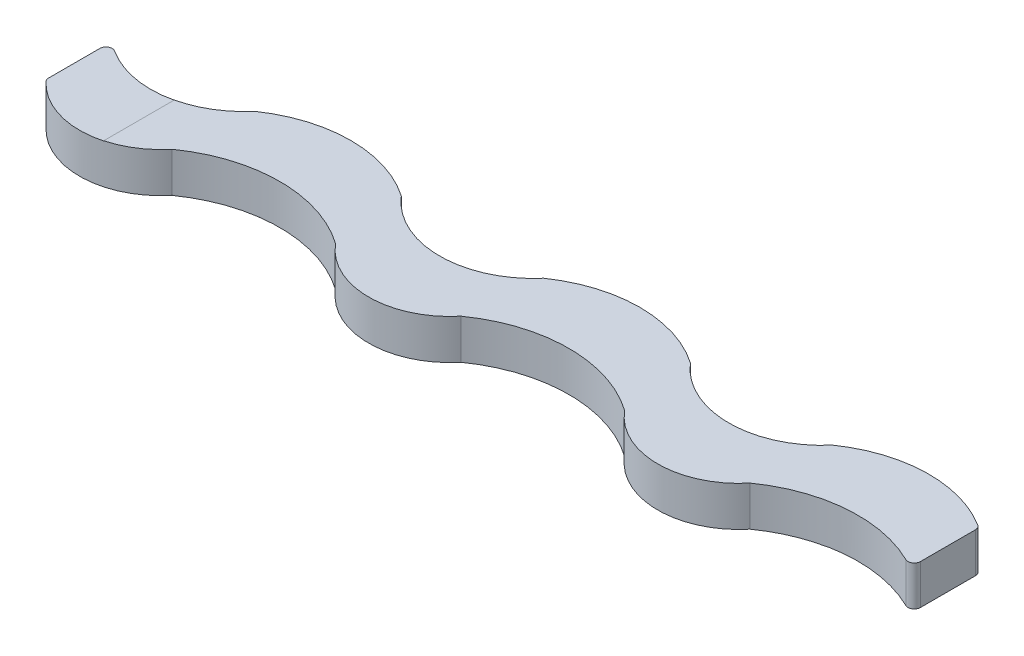
ISO-10303-21;
HEADER;
FILE_DESCRIPTION(('STEP AP214'),'2;1');
FILE_NAME('part.step','',(''),(''),'','','');
FILE_SCHEMA(('AUTOMOTIVE_DESIGN { 1 0 10303 214 1 1 1 1 }'));
ENDSEC;
DATA;
#1=APPLICATION_CONTEXT('core data for automotive mechanical design processes');
#2=APPLICATION_PROTOCOL_DEFINITION('international standard','automotive_design',2000,#1);
#3=PRODUCT_CONTEXT('',#1,'mechanical');
#4=PRODUCT('Part','Part','',(#3));
#5=PRODUCT_RELATED_PRODUCT_CATEGORY('part','',(#4));
#6=PRODUCT_DEFINITION_FORMATION('','',#4);
#7=PRODUCT_DEFINITION_CONTEXT('part definition',#1,'design');
#8=PRODUCT_DEFINITION('design','',#6,#7);
#9=PRODUCT_DEFINITION_SHAPE('','',#8);
#10=(LENGTH_UNIT() NAMED_UNIT(*) SI_UNIT(.MILLI.,.METRE.));
#11=(NAMED_UNIT(*) PLANE_ANGLE_UNIT() SI_UNIT($,.RADIAN.));
#12=(NAMED_UNIT(*) SI_UNIT($,.STERADIAN.) SOLID_ANGLE_UNIT());
#13=UNCERTAINTY_MEASURE_WITH_UNIT(LENGTH_MEASURE(1.E-05),#10,'distance_accuracy_value','');
#14=(GEOMETRIC_REPRESENTATION_CONTEXT(3) GLOBAL_UNCERTAINTY_ASSIGNED_CONTEXT((#13)) GLOBAL_UNIT_ASSIGNED_CONTEXT((#10,
#11,#12)) REPRESENTATION_CONTEXT('',''));
#15=CARTESIAN_POINT('',(0.,0.,0.));
#16=DIRECTION('',(0.,0.,1.));
#17=DIRECTION('',(1.,0.,0.));
#18=AXIS2_PLACEMENT_3D('',#15,#16,#17);
#19=CARTESIAN_POINT('',(-4.86603507649998,-77.2927912107603,5.70716239774827));
#20=DIRECTION('',(-1.,0.,0.));
#21=DIRECTION('',(0.,0.,1.));
#22=AXIS2_PLACEMENT_3D('',#19,#20,#21);
#23=PLANE('',#22);
#24=DIRECTION('',(0.,1.,0.));
#25=VECTOR('',#24,1.);
#26=CARTESIAN_POINT('',(-4.86603507649998,-77.2927912107603,10.8016440320148));
#27=LINE('',#26,#25);
#28=CARTESIAN_POINT('',(-4.86603507649998,0.,10.8016440320148));
#29=VERTEX_POINT('',#28);
#30=CARTESIAN_POINT('',(-4.86603507649998,3.19,10.8016440320148));
#31=VERTEX_POINT('',#30);
#32=EDGE_CURVE('E263',#29,#31,#27,.T.);
#33=ORIENTED_EDGE('',*,*,#32,.T.);
#34=DIRECTION('',(0.,0.,-1.));
#35=VECTOR('',#34,1.);
#36=CARTESIAN_POINT('',(-4.86603507649998,3.19,5.70716239774827));
#37=LINE('',#36,#35);
#38=CARTESIAN_POINT('',(-4.86603507649998,3.19,6.70356156910438));
#39=VERTEX_POINT('',#38);
#40=EDGE_CURVE('E410',#31,#39,#37,.T.);
#41=ORIENTED_EDGE('',*,*,#40,.T.);
#42=DIRECTION('',(0.,1.,0.));
#43=VECTOR('',#42,1.);
#44=CARTESIAN_POINT('',(-4.86603507649998,-77.2927912107603,6.70356156910438));
#45=LINE('',#44,#43);
#46=CARTESIAN_POINT('',(-4.86603507649998,0.,6.70356156910438));
#47=VERTEX_POINT('',#46);
#48=EDGE_CURVE('E261',#39,#47,#45,.F.);
#49=ORIENTED_EDGE('',*,*,#48,.T.);
#50=DIRECTION('',(0.,0.,-1.));
#51=VECTOR('',#50,1.);
#52=CARTESIAN_POINT('',(-4.86603507649998,0.,5.70716239774827));
#53=LINE('',#52,#51);
#54=EDGE_CURVE('E374',#29,#47,#53,.T.);
#55=ORIENTED_EDGE('',*,*,#54,.F.);
#56=EDGE_LOOP('',(#33,#41,#49,#55));
#57=FACE_BOUND('',#56,.T.);
#58=ADVANCED_FACE('F49',(#57),#23,.T.);
#59=CARTESIAN_POINT('',(-4.36603507649998,-77.2927912107603,10.8016440320148));
#60=DIRECTION('',(0.,1.,0.));
#61=DIRECTION('',(0.,0.,1.));
#62=AXIS2_PLACEMENT_3D('',#59,#60,#61);
#63=CYLINDRICAL_SURFACE('',#62,0.5);
#64=DIRECTION('',(0.,1.,0.));
#65=VECTOR('',#64,1.);
#66=CARTESIAN_POINT('',(-4.72987133287497,-77.2927912107603,11.1446063893473));
#67=LINE('',#66,#65);
#68=CARTESIAN_POINT('',(-4.72987133287497,3.19,11.1446063893473));
#69=VERTEX_POINT('',#68);
#70=CARTESIAN_POINT('',(-4.72987133287497,0.,11.1446063893473));
#71=VERTEX_POINT('',#70);
#72=EDGE_CURVE('E271',#69,#71,#67,.F.);
#73=ORIENTED_EDGE('',*,*,#72,.F.);
#74=CARTESIAN_POINT('',(-4.36603507649998,3.19,10.8016440320148));
#75=DIRECTION('',(0.,1.,0.));
#76=DIRECTION('',(0.,0.,1.));
#77=AXIS2_PLACEMENT_3D('',#74,#75,#76);
#78=CIRCLE('',#77,0.5);
#79=EDGE_CURVE('E407',#69,#31,#78,.F.);
#80=ORIENTED_EDGE('',*,*,#79,.T.);
#81=ORIENTED_EDGE('',*,*,#32,.F.);
#82=CARTESIAN_POINT('',(-4.36603507649998,0.,10.8016440320148));
#83=DIRECTION('',(0.,1.,0.));
#84=DIRECTION('',(0.,0.,1.));
#85=AXIS2_PLACEMENT_3D('',#82,#83,#84);
#86=CIRCLE('',#85,0.5);
#87=EDGE_CURVE('E275',#71,#29,#86,.F.);
#88=ORIENTED_EDGE('',*,*,#87,.F.);
#89=EDGE_LOOP('',(#73,#80,#81,#88));
#90=FACE_BOUND('',#89,.T.);
#91=ADVANCED_FACE('F405',(#90),#63,.T.);
#92=CARTESIAN_POINT('',(-4.36603507649998,-77.2927912107603,6.70356156910438));
#93=DIRECTION('',(0.,1.,0.));
#94=DIRECTION('',(0.,0.,1.));
#95=AXIS2_PLACEMENT_3D('',#92,#93,#94);
#96=CYLINDRICAL_SURFACE('',#95,0.5);
#97=ORIENTED_EDGE('',*,*,#48,.F.);
#98=CARTESIAN_POINT('',(-4.36603507649998,3.19,6.70356156910438));
#99=DIRECTION('',(0.,1.,0.));
#100=DIRECTION('',(0.,0.,1.));
#101=AXIS2_PLACEMENT_3D('',#98,#99,#100);
#102=CIRCLE('',#101,0.5);
#103=CARTESIAN_POINT('',(-4.09315788421873,3.19,6.28458897103536));
#104=VERTEX_POINT('',#103);
#105=EDGE_CURVE('E11',#39,#104,#102,.F.);
#106=ORIENTED_EDGE('',*,*,#105,.T.);
#107=DIRECTION('',(0.,1.,0.));
#108=VECTOR('',#107,1.);
#109=CARTESIAN_POINT('',(-4.09315788421873,-77.2927912107603,6.28458897103536));
#110=LINE('',#109,#108);
#111=CARTESIAN_POINT('',(-4.09315788421873,0.,6.28458897103536));
#112=VERTEX_POINT('',#111);
#113=EDGE_CURVE('E277',#112,#104,#110,.T.);
#114=ORIENTED_EDGE('',*,*,#113,.F.);
#115=CARTESIAN_POINT('',(-4.36603507649998,0.,6.70356156910438));
#116=DIRECTION('',(0.,1.,0.));
#117=DIRECTION('',(0.,0.,1.));
#118=AXIS2_PLACEMENT_3D('',#115,#116,#117);
#119=CIRCLE('',#118,0.5);
#120=EDGE_CURVE('E273',#47,#112,#119,.F.);
#121=ORIENTED_EDGE('',*,*,#120,.F.);
#122=EDGE_LOOP('',(#97,#106,#114,#121));
#123=FACE_BOUND('',#122,.T.);
#124=ADVANCED_FACE('F415',(#123),#96,.T.);
#125=CARTESIAN_POINT('',(63.5839649235001,-77.2927912107603,10.2677240935941));
#126=DIRECTION('',(1.,0.,0.));
#127=DIRECTION('',(0.,0.,-1.));
#128=AXIS2_PLACEMENT_3D('',#125,#126,#127);
#129=PLANE('',#128);
#130=DIRECTION('',(0.,1.,0.));
#131=VECTOR('',#130,1.);
#132=CARTESIAN_POINT('',(63.5839649235001,-77.2927912107603,9.43258919898844));
#133=LINE('',#132,#131);
#134=CARTESIAN_POINT('',(63.5839649235001,3.2,9.43258919898844));
#135=VERTEX_POINT('',#134);
#136=CARTESIAN_POINT('',(63.5839649235001,0.00999999999999612,9.43258919898844));
#137=VERTEX_POINT('',#136);
#138=EDGE_CURVE('E280',#135,#137,#133,.F.);
#139=ORIENTED_EDGE('',*,*,#138,.T.);
#140=DIRECTION('',(0.,0.,-1.));
#141=VECTOR('',#140,1.);
#142=CARTESIAN_POINT('',(63.5839649235001,0.00999999999999612,10.2677240935941));
#143=LINE('',#142,#141);
#144=CARTESIAN_POINT('',(63.5839649235001,0.00999999999999612,5.03188760142532));
#145=VERTEX_POINT('',#144);
#146=EDGE_CURVE('E71',#137,#145,#143,.T.);
#147=ORIENTED_EDGE('',*,*,#146,.T.);
#148=DIRECTION('',(0.,1.,0.));
#149=VECTOR('',#148,1.);
#150=CARTESIAN_POINT('',(63.5839649235001,-77.2927912107603,5.03188760142532));
#151=LINE('',#150,#149);
#152=CARTESIAN_POINT('',(63.5839649235001,3.2,5.03188760142532));
#153=VERTEX_POINT('',#152);
#154=EDGE_CURVE('E283',#145,#153,#151,.T.);
#155=ORIENTED_EDGE('',*,*,#154,.T.);
#156=DIRECTION('',(0.,0.,-1.));
#157=VECTOR('',#156,1.);
#158=CARTESIAN_POINT('',(63.5839649235001,3.2,10.2677240935941));
#159=LINE('',#158,#157);
#160=EDGE_CURVE('E322',#135,#153,#159,.T.);
#161=ORIENTED_EDGE('',*,*,#160,.F.);
#162=EDGE_LOOP('',(#139,#147,#155,#161));
#163=FACE_BOUND('',#162,.T.);
#164=ADVANCED_FACE('F438',(#163),#129,.T.);
#165=CARTESIAN_POINT('',(63.0839649235001,-77.2927912107603,5.03188760142532));
#166=DIRECTION('',(0.,1.,0.));
#167=DIRECTION('',(0.,0.,1.));
#168=AXIS2_PLACEMENT_3D('',#165,#166,#167);
#169=CYLINDRICAL_SURFACE('',#168,0.5);
#170=ORIENTED_EDGE('',*,*,#154,.F.);
#171=CARTESIAN_POINT('',(63.0839649235001,0.00999999999999612,5.03188760142532));
#172=DIRECTION('',(0.,-1.,0.));
#173=DIRECTION('',(0.,0.,-1.));
#174=AXIS2_PLACEMENT_3D('',#171,#172,#173);
#175=CIRCLE('',#174,0.5);
#176=CARTESIAN_POINT('',(63.3490521969606,0.00999999999999612,4.60794333922892));
#177=VERTEX_POINT('',#176);
#178=EDGE_CURVE('E355',#145,#177,#175,.F.);
#179=ORIENTED_EDGE('',*,*,#178,.T.);
#180=DIRECTION('',(0.,1.,0.));
#181=VECTOR('',#180,1.);
#182=CARTESIAN_POINT('',(63.3490521969606,-77.2927912107603,4.60794333922892));
#183=LINE('',#182,#181);
#184=CARTESIAN_POINT('',(63.3490521969606,3.2,4.60794333922892));
#185=VERTEX_POINT('',#184);
#186=EDGE_CURVE('E285',#185,#177,#183,.F.);
#187=ORIENTED_EDGE('',*,*,#186,.F.);
#188=CARTESIAN_POINT('',(63.0839649235001,3.19999999999999,5.03188760142532));
#189=DIRECTION('',(0.,1.,0.));
#190=DIRECTION('',(0.,0.,1.));
#191=AXIS2_PLACEMENT_3D('',#188,#189,#190);
#192=CIRCLE('',#191,0.5);
#193=EDGE_CURVE('E269',#153,#185,#192,.T.);
#194=ORIENTED_EDGE('',*,*,#193,.F.);
#195=EDGE_LOOP('',(#170,#179,#187,#194));
#196=FACE_BOUND('',#195,.T.);
#197=ADVANCED_FACE('F442',(#196),#169,.T.);
#198=CARTESIAN_POINT('',(63.0839649235001,-77.2927912107603,9.43258919898844));
#199=DIRECTION('',(0.,1.,0.));
#200=DIRECTION('',(0.,0.,1.));
#201=AXIS2_PLACEMENT_3D('',#198,#199,#200);
#202=CYLINDRICAL_SURFACE('',#201,0.5);
#203=DIRECTION('',(0.,1.,0.));
#204=VECTOR('',#203,1.);
#205=CARTESIAN_POINT('',(62.8637127068616,-77.2927912107603,9.88146441668913));
#206=LINE('',#205,#204);
#207=CARTESIAN_POINT('',(62.8637127068616,0.00999999999999612,9.88146441668913));
#208=VERTEX_POINT('',#207);
#209=CARTESIAN_POINT('',(62.8637127068616,3.2,9.88146441668913));
#210=VERTEX_POINT('',#209);
#211=EDGE_CURVE('E288',#208,#210,#206,.T.);
#212=ORIENTED_EDGE('',*,*,#211,.F.);
#213=CARTESIAN_POINT('',(63.0839649235001,0.00999999999999612,9.43258919898844));
#214=DIRECTION('',(0.,-1.,0.));
#215=DIRECTION('',(0.,0.,-1.));
#216=AXIS2_PLACEMENT_3D('',#213,#214,#215);
#217=CIRCLE('',#216,0.5);
#218=EDGE_CURVE('E290',#208,#137,#217,.F.);
#219=ORIENTED_EDGE('',*,*,#218,.T.);
#220=ORIENTED_EDGE('',*,*,#138,.F.);
#221=CARTESIAN_POINT('',(63.0839649235001,3.19999999999999,9.43258919898844));
#222=DIRECTION('',(0.,1.,0.));
#223=DIRECTION('',(0.,0.,1.));
#224=AXIS2_PLACEMENT_3D('',#221,#222,#223);
#225=CIRCLE('',#224,0.5);
#226=EDGE_CURVE('E267',#210,#135,#225,.T.);
#227=ORIENTED_EDGE('',*,*,#226,.F.);
#228=EDGE_LOOP('',(#212,#219,#220,#227));
#229=FACE_BOUND('',#228,.T.);
#230=ADVANCED_FACE('F51',(#229),#202,.T.);
#231=CARTESIAN_POINT('',(0.,0.,0.));
#232=DIRECTION('',(0.,1.,0.));
#233=DIRECTION('',(0.,0.,1.));
#234=AXIS2_PLACEMENT_3D('',#231,#232,#233);
#235=PLANE('',#234);
#236=CARTESIAN_POINT('',(57.875,0.,13.3623923535845));
#237=DIRECTION('',(0.,1.,0.));
#238=DIRECTION('',(0.,0.,1.));
#239=AXIS2_PLACEMENT_3D('',#236,#237,#238);
#240=CIRCLE('',#239,10.3250000000001);
#241=CARTESIAN_POINT('',(52.0054540078226,0.,4.86803806113145));
#242=VERTEX_POINT('',#241);
#243=CARTESIAN_POINT('',(55.6739714249146,0.,3.27472174974049));
#244=VERTEX_POINT('',#243);
#245=EDGE_CURVE('E264',#242,#244,#240,.F.);
#246=ORIENTED_EDGE('',*,*,#245,.T.);
#247=DIRECTION('',(0.,0.,-1.));
#248=VECTOR('',#247,1.);
#249=CARTESIAN_POINT('',(55.6739714249146,0.,27.2534178741779));
#250=LINE('',#249,#248);
#251=CARTESIAN_POINT('',(55.6739714249146,0.,8.93943331281102));
#252=VERTEX_POINT('',#251);
#253=EDGE_CURVE('E296',#252,#244,#250,.T.);
#254=ORIENTED_EDGE('',*,*,#253,.F.);
#255=CARTESIAN_POINT('',(57.8750000000001,0.,20.0484880976097));
#256=DIRECTION('',(0.,1.,0.));
#257=DIRECTION('',(0.,0.,1.));
#258=AXIS2_PLACEMENT_3D('',#255,#256,#257);
#259=CIRCLE('',#258,11.3250000000001);
#260=CARTESIAN_POINT('',(51.3236509739897,0.,10.8107691724965));
#261=VERTEX_POINT('',#260);
#262=EDGE_CURVE('E243',#252,#261,#259,.T.);
#263=ORIENTED_EDGE('',*,*,#262,.T.);
#264=CARTESIAN_POINT('',(46.3000000000001,0.,6.68609574402523));
#265=DIRECTION('',(0.,1.,0.));
#266=DIRECTION('',(0.,0.,1.));
#267=AXIS2_PLACEMENT_3D('',#264,#265,#266);
#268=CIRCLE('',#267,6.50000000000026);
#269=CARTESIAN_POINT('',(41.2763490260104,0.,10.8107691724964));
#270=VERTEX_POINT('',#269);
#271=EDGE_CURVE('E313',#261,#270,#268,.F.);
#272=ORIENTED_EDGE('',*,*,#271,.T.);
#273=CARTESIAN_POINT('',(34.7250000000001,0.,20.0484880976097));
#274=DIRECTION('',(0.,1.,0.));
#275=DIRECTION('',(0.,0.,1.));
#276=AXIS2_PLACEMENT_3D('',#273,#274,#275);
#277=CIRCLE('',#276,11.3250000000001);
#278=CARTESIAN_POINT('',(28.1736509739897,0.,10.8107691724964));
#279=VERTEX_POINT('',#278);
#280=EDGE_CURVE('E315',#270,#279,#277,.T.);
#281=ORIENTED_EDGE('',*,*,#280,.T.);
#282=CARTESIAN_POINT('',(23.1500000000001,0.,6.68609574402525));
#283=DIRECTION('',(0.,1.,0.));
#284=DIRECTION('',(0.,0.,1.));
#285=AXIS2_PLACEMENT_3D('',#282,#283,#284);
#286=CIRCLE('',#285,6.50000000000023);
#287=CARTESIAN_POINT('',(18.1263490260105,0.,10.8107691724964));
#288=VERTEX_POINT('',#287);
#289=EDGE_CURVE('E383',#279,#288,#286,.F.);
#290=ORIENTED_EDGE('',*,*,#289,.T.);
#291=CARTESIAN_POINT('',(11.5750000000001,0.,20.0484880976097));
#292=DIRECTION('',(0.,1.,0.));
#293=DIRECTION('',(0.,0.,1.));
#294=AXIS2_PLACEMENT_3D('',#291,#292,#293);
#295=CIRCLE('',#294,11.3250000000001);
#296=CARTESIAN_POINT('',(5.02365097398963,0.,10.8107691724964));
#297=VERTEX_POINT('',#296);
#298=EDGE_CURVE('E380',#288,#297,#295,.T.);
#299=ORIENTED_EDGE('',*,*,#298,.T.);
#300=CARTESIAN_POINT('',(0.,0.,6.68609574402533));
#301=DIRECTION('',(0.,1.,0.));
#302=DIRECTION('',(0.,0.,1.));
#303=AXIS2_PLACEMENT_3D('',#300,#301,#302);
#304=CIRCLE('',#303,6.50000000000014);
#305=EDGE_CURVE('E377',#297,#71,#304,.F.);
#306=ORIENTED_EDGE('',*,*,#305,.T.);
#307=ORIENTED_EDGE('',*,*,#87,.T.);
#308=ORIENTED_EDGE('',*,*,#54,.T.);
#309=ORIENTED_EDGE('',*,*,#120,.T.);
#310=CARTESIAN_POINT('',(0.,0.,0.));
#311=DIRECTION('',(0.,1.,0.));
#312=DIRECTION('',(0.,0.,1.));
#313=AXIS2_PLACEMENT_3D('',#310,#311,#312);
#314=CIRCLE('',#313,7.50000000000009);
#315=CARTESIAN_POINT('',(5.70545400782265,0.,4.86803806113131));
#316=VERTEX_POINT('',#315);
#317=EDGE_CURVE('E372',#112,#316,#314,.T.);
#318=ORIENTED_EDGE('',*,*,#317,.T.);
#319=CARTESIAN_POINT('',(11.575,0.,13.3623923535845));
#320=DIRECTION('',(0.,1.,0.));
#321=DIRECTION('',(0.,0.,1.));
#322=AXIS2_PLACEMENT_3D('',#319,#320,#321);
#323=CIRCLE('',#322,10.3250000000001);
#324=CARTESIAN_POINT('',(17.4445459921774,0.,4.8680380611314));
#325=VERTEX_POINT('',#324);
#326=EDGE_CURVE('E344',#316,#325,#323,.F.);
#327=ORIENTED_EDGE('',*,*,#326,.T.);
#328=CARTESIAN_POINT('',(23.15,0.,0.));
#329=DIRECTION('',(0.,1.,0.));
#330=DIRECTION('',(0.,0.,1.));
#331=AXIS2_PLACEMENT_3D('',#328,#329,#330);
#332=CIRCLE('',#331,7.50000000000017);
#333=CARTESIAN_POINT('',(28.8554540078226,0.,4.8680380611314));
#334=VERTEX_POINT('',#333);
#335=EDGE_CURVE('E368',#325,#334,#332,.T.);
#336=ORIENTED_EDGE('',*,*,#335,.T.);
#337=CARTESIAN_POINT('',(34.725,0.,13.3623923535845));
#338=DIRECTION('',(0.,1.,0.));
#339=DIRECTION('',(0.,0.,1.));
#340=AXIS2_PLACEMENT_3D('',#337,#338,#339);
#341=CIRCLE('',#340,10.3250000000001);
#342=CARTESIAN_POINT('',(40.5945459921774,0.,4.86803806113141));
#343=VERTEX_POINT('',#342);
#344=EDGE_CURVE('E365',#334,#343,#341,.F.);
#345=ORIENTED_EDGE('',*,*,#344,.T.);
#346=CARTESIAN_POINT('',(46.3,0.,0.));
#347=DIRECTION('',(0.,1.,0.));
#348=DIRECTION('',(0.,0.,1.));
#349=AXIS2_PLACEMENT_3D('',#346,#347,#348);
#350=CIRCLE('',#349,7.50000000000017);
#351=EDGE_CURVE('E363',#343,#242,#350,.T.);
#352=ORIENTED_EDGE('',*,*,#351,.T.);
#353=EDGE_LOOP('',(#246,#254,#263,#272,#281,#290,#299,#306,#307,#308,#309,#318,#327,#336,#345,#352));
#354=FACE_BOUND('',#353,.T.);
#355=ADVANCED_FACE('F305',(#354),#235,.F.);
#356=CARTESIAN_POINT('',(57.875,-77.2927912107603,13.3623923535845));
#357=DIRECTION('',(0.,1.,0.));
#358=DIRECTION('',(0.,0.,1.));
#359=AXIS2_PLACEMENT_3D('',#356,#357,#358);
#360=CYLINDRICAL_SURFACE('',#359,10.3250000000001);
#361=DIRECTION('',(0.,1.,0.));
#362=VECTOR('',#361,1.);
#363=CARTESIAN_POINT('',(55.6739714249146,-77.2927912107603,3.27472174974049));
#364=LINE('',#363,#362);
#365=CARTESIAN_POINT('',(55.6739714249146,0.00999999999999612,3.27472174974049));
#366=VERTEX_POINT('',#365);
#367=EDGE_CURVE('E323',#244,#366,#364,.T.);
#368=ORIENTED_EDGE('',*,*,#367,.F.);
#369=ORIENTED_EDGE('',*,*,#245,.F.);
#370=DIRECTION('',(0.,1.,0.));
#371=VECTOR('',#370,1.);
#372=CARTESIAN_POINT('',(52.0054540078226,-77.2927912107603,4.86803806113145));
#373=LINE('',#372,#371);
#374=CARTESIAN_POINT('',(52.0054540078226,3.2,4.86803806113145));
#375=VERTEX_POINT('',#374);
#376=EDGE_CURVE('E240',#242,#375,#373,.T.);
#377=ORIENTED_EDGE('',*,*,#376,.T.);
#378=CARTESIAN_POINT('',(57.875,3.2,13.3623923535845));
#379=DIRECTION('',(0.,1.,0.));
#380=DIRECTION('',(0.,0.,1.));
#381=AXIS2_PLACEMENT_3D('',#378,#379,#380);
#382=CIRCLE('',#381,10.3250000000001);
#383=EDGE_CURVE('E326',#185,#375,#382,.T.);
#384=ORIENTED_EDGE('',*,*,#383,.F.);
#385=ORIENTED_EDGE('',*,*,#186,.T.);
#386=CARTESIAN_POINT('',(57.875,0.00999999999999612,13.3623923535845));
#387=DIRECTION('',(0.,-1.,0.));
#388=DIRECTION('',(0.,0.,-1.));
#389=AXIS2_PLACEMENT_3D('',#386,#387,#388);
#390=CIRCLE('',#389,10.3250000000001);
#391=EDGE_CURVE('E358',#177,#366,#390,.F.);
#392=ORIENTED_EDGE('',*,*,#391,.T.);
#393=EDGE_LOOP('',(#368,#369,#377,#384,#385,#392));
#394=FACE_BOUND('',#393,.T.);
#395=ADVANCED_FACE('F429',(#394),#360,.T.);
#396=CARTESIAN_POINT('',(46.3,-77.2927912107603,0.));
#397=DIRECTION('',(0.,1.,0.));
#398=DIRECTION('',(0.,0.,1.));
#399=AXIS2_PLACEMENT_3D('',#396,#397,#398);
#400=CYLINDRICAL_SURFACE('',#399,7.50000000000017);
#401=DIRECTION('',(0.,1.,0.));
#402=VECTOR('',#401,1.);
#403=CARTESIAN_POINT('',(40.5945459921774,-77.2927912107603,4.8680380611314));
#404=LINE('',#403,#402);
#405=CARTESIAN_POINT('',(40.5945459921774,3.2,4.8680380611314));
#406=VERTEX_POINT('',#405);
#407=EDGE_CURVE('E257',#343,#406,#404,.T.);
#408=ORIENTED_EDGE('',*,*,#407,.T.);
#409=CARTESIAN_POINT('',(46.3,3.2,0.));
#410=DIRECTION('',(0.,-1.,0.));
#411=DIRECTION('',(0.,0.,1.));
#412=AXIS2_PLACEMENT_3D('',#409,#410,#411);
#413=CIRCLE('',#412,7.50000000000017);
#414=EDGE_CURVE('E328',#375,#406,#413,.T.);
#415=ORIENTED_EDGE('',*,*,#414,.F.);
#416=ORIENTED_EDGE('',*,*,#376,.F.);
#417=ORIENTED_EDGE('',*,*,#351,.F.);
#418=EDGE_LOOP('',(#408,#415,#416,#417));
#419=FACE_BOUND('',#418,.T.);
#420=ADVANCED_FACE('F425',(#419),#400,.F.);
#421=CARTESIAN_POINT('',(34.725,-77.2927912107603,13.3623923535845));
#422=DIRECTION('',(0.,1.,0.));
#423=DIRECTION('',(0.,0.,1.));
#424=AXIS2_PLACEMENT_3D('',#421,#422,#423);
#425=CYLINDRICAL_SURFACE('',#424,10.3250000000001);
#426=DIRECTION('',(0.,1.,0.));
#427=VECTOR('',#426,1.);
#428=CARTESIAN_POINT('',(28.8554540078226,-77.2927912107603,4.86803806113139));
#429=LINE('',#428,#427);
#430=CARTESIAN_POINT('',(28.8554540078226,3.2,4.86803806113139));
#431=VERTEX_POINT('',#430);
#432=EDGE_CURVE('E255',#334,#431,#429,.T.);
#433=ORIENTED_EDGE('',*,*,#432,.T.);
#434=CARTESIAN_POINT('',(34.725,3.2,13.3623923535845));
#435=DIRECTION('',(0.,1.,0.));
#436=DIRECTION('',(0.,0.,1.));
#437=AXIS2_PLACEMENT_3D('',#434,#435,#436);
#438=CIRCLE('',#437,10.3250000000001);
#439=EDGE_CURVE('E331',#406,#431,#438,.T.);
#440=ORIENTED_EDGE('',*,*,#439,.F.);
#441=ORIENTED_EDGE('',*,*,#407,.F.);
#442=ORIENTED_EDGE('',*,*,#344,.F.);
#443=EDGE_LOOP('',(#433,#440,#441,#442));
#444=FACE_BOUND('',#443,.T.);
#445=ADVANCED_FACE('F421',(#444),#425,.T.);
#446=CARTESIAN_POINT('',(23.15,-77.2927912107603,0.));
#447=DIRECTION('',(0.,1.,0.));
#448=DIRECTION('',(0.,0.,1.));
#449=AXIS2_PLACEMENT_3D('',#446,#447,#448);
#450=CYLINDRICAL_SURFACE('',#449,7.50000000000017);
#451=DIRECTION('',(0.,1.,0.));
#452=VECTOR('',#451,1.);
#453=CARTESIAN_POINT('',(17.4445459921774,-77.2927912107603,4.8680380611314));
#454=LINE('',#453,#452);
#455=CARTESIAN_POINT('',(17.4445459921774,3.2,4.8680380611314));
#456=VERTEX_POINT('',#455);
#457=EDGE_CURVE('E253',#325,#456,#454,.T.);
#458=ORIENTED_EDGE('',*,*,#457,.T.);
#459=CARTESIAN_POINT('',(23.15,3.2,0.));
#460=DIRECTION('',(0.,-1.,0.));
#461=DIRECTION('',(0.,0.,1.));
#462=AXIS2_PLACEMENT_3D('',#459,#460,#461);
#463=CIRCLE('',#462,7.50000000000017);
#464=EDGE_CURVE('E334',#431,#456,#463,.T.);
#465=ORIENTED_EDGE('',*,*,#464,.F.);
#466=ORIENTED_EDGE('',*,*,#432,.F.);
#467=ORIENTED_EDGE('',*,*,#335,.F.);
#468=EDGE_LOOP('',(#458,#465,#466,#467));
#469=FACE_BOUND('',#468,.T.);
#470=ADVANCED_FACE('F418',(#469),#450,.F.);
#471=CARTESIAN_POINT('',(11.575,-77.2927912107603,13.3623923535845));
#472=DIRECTION('',(0.,1.,0.));
#473=DIRECTION('',(0.,0.,1.));
#474=AXIS2_PLACEMENT_3D('',#471,#472,#473);
#475=CYLINDRICAL_SURFACE('',#474,10.3250000000001);
#476=DIRECTION('',(0.,1.,0.));
#477=VECTOR('',#476,1.);
#478=CARTESIAN_POINT('',(5.70545400782265,-77.2927912107603,4.86803806113131));
#479=LINE('',#478,#477);
#480=CARTESIAN_POINT('',(5.70545400782265,3.2,4.86803806113131));
#481=VERTEX_POINT('',#480);
#482=EDGE_CURVE('E251',#316,#481,#479,.T.);
#483=ORIENTED_EDGE('',*,*,#482,.T.);
#484=CARTESIAN_POINT('',(11.575,3.2,13.3623923535845));
#485=DIRECTION('',(0.,1.,0.));
#486=DIRECTION('',(0.,0.,1.));
#487=AXIS2_PLACEMENT_3D('',#484,#485,#486);
#488=CIRCLE('',#487,10.3250000000001);
#489=EDGE_CURVE('E228',#456,#481,#488,.T.);
#490=ORIENTED_EDGE('',*,*,#489,.F.);
#491=ORIENTED_EDGE('',*,*,#457,.F.);
#492=ORIENTED_EDGE('',*,*,#326,.F.);
#493=EDGE_LOOP('',(#483,#490,#491,#492));
#494=FACE_BOUND('',#493,.T.);
#495=ADVANCED_FACE('F340',(#494),#475,.T.);
#496=CARTESIAN_POINT('',(0.,-77.2927912107603,0.));
#497=DIRECTION('',(0.,1.,0.));
#498=DIRECTION('',(0.,0.,1.));
#499=AXIS2_PLACEMENT_3D('',#496,#497,#498);
#500=CYLINDRICAL_SURFACE('',#499,7.50000000000009);
#501=DIRECTION('',(0.,1.,0.));
#502=VECTOR('',#501,1.);
#503=CARTESIAN_POINT('',(1.70135604956435,-77.2927912107603,7.30447722924865));
#504=LINE('',#503,#502);
#505=CARTESIAN_POINT('',(1.70135604956435,3.2,7.30447722924866));
#506=VERTEX_POINT('',#505);
#507=CARTESIAN_POINT('',(1.70135604956435,3.19,7.30447722924865));
#508=VERTEX_POINT('',#507);
#509=EDGE_CURVE('E207',#506,#508,#504,.F.);
#510=ORIENTED_EDGE('',*,*,#509,.F.);
#511=CARTESIAN_POINT('',(0.,3.2,0.));
#512=DIRECTION('',(0.,-1.,0.));
#513=DIRECTION('',(0.,0.,1.));
#514=AXIS2_PLACEMENT_3D('',#511,#512,#513);
#515=CIRCLE('',#514,7.50000000000009);
#516=EDGE_CURVE('E218',#481,#506,#515,.T.);
#517=ORIENTED_EDGE('',*,*,#516,.F.);
#518=ORIENTED_EDGE('',*,*,#482,.F.);
#519=ORIENTED_EDGE('',*,*,#317,.F.);
#520=ORIENTED_EDGE('',*,*,#113,.T.);
#521=CARTESIAN_POINT('',(0.,3.19,0.));
#522=DIRECTION('',(0.,1.,0.));
#523=DIRECTION('',(0.,0.,1.));
#524=AXIS2_PLACEMENT_3D('',#521,#522,#523);
#525=CIRCLE('',#524,7.50000000000009);
#526=EDGE_CURVE('E64',#104,#508,#525,.T.);
#527=ORIENTED_EDGE('',*,*,#526,.T.);
#528=EDGE_LOOP('',(#510,#517,#518,#519,#520,#527));
#529=FACE_BOUND('',#528,.T.);
#530=ADVANCED_FACE('F347',(#529),#500,.F.);
#531=CARTESIAN_POINT('',(0.,-77.2927912107603,6.68609574402533));
#532=DIRECTION('',(0.,1.,0.));
#533=DIRECTION('',(0.,0.,1.));
#534=AXIS2_PLACEMENT_3D('',#531,#532,#533);
#535=CYLINDRICAL_SURFACE('',#534,6.50000000000014);
#536=DIRECTION('',(0.,1.,0.));
#537=VECTOR('',#536,1.);
#538=CARTESIAN_POINT('',(1.70135604956435,-77.2927912107603,12.9594829943561));
#539=LINE('',#538,#537);
#540=CARTESIAN_POINT('',(1.70135604956435,3.19,12.9594829943561));
#541=VERTEX_POINT('',#540);
#542=CARTESIAN_POINT('',(1.70135604956435,3.2,12.9594829943561));
#543=VERTEX_POINT('',#542);
#544=EDGE_CURVE('E198',#541,#543,#539,.T.);
#545=ORIENTED_EDGE('',*,*,#544,.F.);
#546=CARTESIAN_POINT('',(0.,3.19,6.68609574402533));
#547=DIRECTION('',(0.,1.,0.));
#548=DIRECTION('',(0.,0.,1.));
#549=AXIS2_PLACEMENT_3D('',#546,#547,#548);
#550=CIRCLE('',#549,6.50000000000014);
#551=EDGE_CURVE('E208',#541,#69,#550,.F.);
#552=ORIENTED_EDGE('',*,*,#551,.T.);
#553=ORIENTED_EDGE('',*,*,#72,.T.);
#554=ORIENTED_EDGE('',*,*,#305,.F.);
#555=DIRECTION('',(0.,1.,0.));
#556=VECTOR('',#555,1.);
#557=CARTESIAN_POINT('',(5.02365097398963,-77.2927912107603,10.8107691724964));
#558=LINE('',#557,#556);
#559=CARTESIAN_POINT('',(5.02365097398963,3.2,10.8107691724964));
#560=VERTEX_POINT('',#559);
#561=EDGE_CURVE('E222',#297,#560,#558,.T.);
#562=ORIENTED_EDGE('',*,*,#561,.T.);
#563=CARTESIAN_POINT('',(0.,3.2,6.68609574402533));
#564=DIRECTION('',(0.,1.,0.));
#565=DIRECTION('',(0.,0.,1.));
#566=AXIS2_PLACEMENT_3D('',#563,#564,#565);
#567=CIRCLE('',#566,6.50000000000014);
#568=EDGE_CURVE('E214',#543,#560,#567,.T.);
#569=ORIENTED_EDGE('',*,*,#568,.F.);
#570=EDGE_LOOP('',(#545,#552,#553,#554,#562,#569));
#571=FACE_BOUND('',#570,.T.);
#572=ADVANCED_FACE('F220',(#571),#535,.T.);
#573=CARTESIAN_POINT('',(11.5750000000001,-77.2927912107603,20.0484880976097));
#574=DIRECTION('',(0.,1.,0.));
#575=DIRECTION('',(0.,0.,1.));
#576=AXIS2_PLACEMENT_3D('',#573,#574,#575);
#577=CYLINDRICAL_SURFACE('',#576,11.3250000000001);
#578=DIRECTION('',(0.,1.,0.));
#579=VECTOR('',#578,1.);
#580=CARTESIAN_POINT('',(18.1263490260105,-77.2927912107603,10.8107691724964));
#581=LINE('',#580,#579);
#582=CARTESIAN_POINT('',(18.1263490260105,3.2,10.8107691724964));
#583=VERTEX_POINT('',#582);
#584=EDGE_CURVE('E248',#288,#583,#581,.T.);
#585=ORIENTED_EDGE('',*,*,#584,.T.);
#586=CARTESIAN_POINT('',(11.5750000000001,3.2,20.0484880976097));
#587=DIRECTION('',(0.,-1.,0.));
#588=DIRECTION('',(0.,0.,1.));
#589=AXIS2_PLACEMENT_3D('',#586,#587,#588);
#590=CIRCLE('',#589,11.3250000000001);
#591=EDGE_CURVE('E224',#560,#583,#590,.T.);
#592=ORIENTED_EDGE('',*,*,#591,.F.);
#593=ORIENTED_EDGE('',*,*,#561,.F.);
#594=ORIENTED_EDGE('',*,*,#298,.F.);
#595=EDGE_LOOP('',(#585,#592,#593,#594));
#596=FACE_BOUND('',#595,.T.);
#597=ADVANCED_FACE('F399',(#596),#577,.F.);
#598=CARTESIAN_POINT('',(23.1500000000001,-77.2927912107603,6.68609574402525));
#599=DIRECTION('',(0.,1.,0.));
#600=DIRECTION('',(0.,0.,1.));
#601=AXIS2_PLACEMENT_3D('',#598,#599,#600);
#602=CYLINDRICAL_SURFACE('',#601,6.50000000000023);
#603=DIRECTION('',(0.,1.,0.));
#604=VECTOR('',#603,1.);
#605=CARTESIAN_POINT('',(28.1736509739897,-77.2927912107603,10.8107691724965));
#606=LINE('',#605,#604);
#607=CARTESIAN_POINT('',(28.1736509739897,3.2,10.8107691724965));
#608=VERTEX_POINT('',#607);
#609=EDGE_CURVE('E246',#279,#608,#606,.T.);
#610=ORIENTED_EDGE('',*,*,#609,.T.);
#611=CARTESIAN_POINT('',(23.1500000000001,3.2,6.68609574402525));
#612=DIRECTION('',(0.,1.,0.));
#613=DIRECTION('',(0.,0.,1.));
#614=AXIS2_PLACEMENT_3D('',#611,#612,#613);
#615=CIRCLE('',#614,6.50000000000023);
#616=EDGE_CURVE('E226',#583,#608,#615,.T.);
#617=ORIENTED_EDGE('',*,*,#616,.F.);
#618=ORIENTED_EDGE('',*,*,#584,.F.);
#619=ORIENTED_EDGE('',*,*,#289,.F.);
#620=EDGE_LOOP('',(#610,#617,#618,#619));
#621=FACE_BOUND('',#620,.T.);
#622=ADVANCED_FACE('F397',(#621),#602,.T.);
#623=CARTESIAN_POINT('',(34.7250000000001,-77.2927912107603,20.0484880976097));
#624=DIRECTION('',(0.,1.,0.));
#625=DIRECTION('',(0.,0.,1.));
#626=AXIS2_PLACEMENT_3D('',#623,#624,#625);
#627=CYLINDRICAL_SURFACE('',#626,11.3250000000001);
#628=DIRECTION('',(0.,1.,0.));
#629=VECTOR('',#628,1.);
#630=CARTESIAN_POINT('',(41.2763490260104,-77.2927912107603,10.8107691724964));
#631=LINE('',#630,#629);
#632=CARTESIAN_POINT('',(41.2763490260104,3.2,10.8107691724964));
#633=VERTEX_POINT('',#632);
#634=EDGE_CURVE('E244',#270,#633,#631,.T.);
#635=ORIENTED_EDGE('',*,*,#634,.T.);
#636=CARTESIAN_POINT('',(34.7250000000001,3.2,20.0484880976097));
#637=DIRECTION('',(0.,-1.,0.));
#638=DIRECTION('',(0.,0.,1.));
#639=AXIS2_PLACEMENT_3D('',#636,#637,#638);
#640=CIRCLE('',#639,11.3250000000001);
#641=EDGE_CURVE('E234',#608,#633,#640,.T.);
#642=ORIENTED_EDGE('',*,*,#641,.F.);
#643=ORIENTED_EDGE('',*,*,#609,.F.);
#644=ORIENTED_EDGE('',*,*,#280,.F.);
#645=EDGE_LOOP('',(#635,#642,#643,#644));
#646=FACE_BOUND('',#645,.T.);
#647=ADVANCED_FACE('F389',(#646),#627,.F.);
#648=CARTESIAN_POINT('',(46.3000000000001,-77.2927912107603,6.68609574402523));
#649=DIRECTION('',(0.,1.,0.));
#650=DIRECTION('',(0.,0.,1.));
#651=AXIS2_PLACEMENT_3D('',#648,#649,#650);
#652=CYLINDRICAL_SURFACE('',#651,6.50000000000026);
#653=DIRECTION('',(0.,1.,0.));
#654=VECTOR('',#653,1.);
#655=CARTESIAN_POINT('',(51.3236509739896,-77.2927912107603,10.8107691724965));
#656=LINE('',#655,#654);
#657=CARTESIAN_POINT('',(51.3236509739896,3.2,10.8107691724965));
#658=VERTEX_POINT('',#657);
#659=EDGE_CURVE('E241',#261,#658,#656,.T.);
#660=ORIENTED_EDGE('',*,*,#659,.T.);
#661=CARTESIAN_POINT('',(46.3000000000001,3.2,6.68609574402523));
#662=DIRECTION('',(0.,1.,0.));
#663=DIRECTION('',(0.,0.,1.));
#664=AXIS2_PLACEMENT_3D('',#661,#662,#663);
#665=CIRCLE('',#664,6.50000000000026);
#666=EDGE_CURVE('E237',#633,#658,#665,.T.);
#667=ORIENTED_EDGE('',*,*,#666,.F.);
#668=ORIENTED_EDGE('',*,*,#634,.F.);
#669=ORIENTED_EDGE('',*,*,#271,.F.);
#670=EDGE_LOOP('',(#660,#667,#668,#669));
#671=FACE_BOUND('',#670,.T.);
#672=ADVANCED_FACE('F393',(#671),#652,.T.);
#673=CARTESIAN_POINT('',(57.8750000000001,-77.2927912107603,20.0484880976097));
#674=DIRECTION('',(0.,1.,0.));
#675=DIRECTION('',(0.,0.,1.));
#676=AXIS2_PLACEMENT_3D('',#673,#674,#675);
#677=CYLINDRICAL_SURFACE('',#676,11.3250000000001);
#678=DIRECTION('',(0.,1.,0.));
#679=VECTOR('',#678,1.);
#680=CARTESIAN_POINT('',(55.6739714249146,-77.2927912107603,8.93943331281103));
#681=LINE('',#680,#679);
#682=CARTESIAN_POINT('',(55.6739714249146,0.00999999999999612,8.93943331281102));
#683=VERTEX_POINT('',#682);
#684=EDGE_CURVE('E57',#683,#252,#681,.F.);
#685=ORIENTED_EDGE('',*,*,#684,.F.);
#686=CARTESIAN_POINT('',(57.8750000000001,0.00999999999999612,20.0484880976097));
#687=DIRECTION('',(0.,-1.,0.));
#688=DIRECTION('',(0.,0.,-1.));
#689=AXIS2_PLACEMENT_3D('',#686,#687,#688);
#690=CIRCLE('',#689,11.3250000000001);
#691=EDGE_CURVE('E351',#683,#208,#690,.T.);
#692=ORIENTED_EDGE('',*,*,#691,.T.);
#693=ORIENTED_EDGE('',*,*,#211,.T.);
#694=CARTESIAN_POINT('',(57.8750000000001,3.2,20.0484880976097));
#695=DIRECTION('',(0.,-1.,0.));
#696=DIRECTION('',(0.,0.,1.));
#697=AXIS2_PLACEMENT_3D('',#694,#695,#696);
#698=CIRCLE('',#697,11.3250000000001);
#699=EDGE_CURVE('E319',#658,#210,#698,.T.);
#700=ORIENTED_EDGE('',*,*,#699,.F.);
#701=ORIENTED_EDGE('',*,*,#659,.F.);
#702=ORIENTED_EDGE('',*,*,#262,.F.);
#703=EDGE_LOOP('',(#685,#692,#693,#700,#701,#702));
#704=FACE_BOUND('',#703,.T.);
#705=ADVANCED_FACE('F310',(#704),#677,.F.);
#706=CARTESIAN_POINT('',(0.,3.2,0.));
#707=DIRECTION('',(0.,1.,0.));
#708=DIRECTION('',(0.,0.,1.));
#709=AXIS2_PLACEMENT_3D('',#706,#707,#708);
#710=PLANE('',#709);
#711=DIRECTION('',(0.,0.,-1.));
#712=VECTOR('',#711,1.);
#713=CARTESIAN_POINT('',(1.70135604956435,3.2,-15.6303173349234));
#714=LINE('',#713,#712);
#715=EDGE_CURVE('E201',#543,#506,#714,.T.);
#716=ORIENTED_EDGE('',*,*,#715,.F.);
#717=ORIENTED_EDGE('',*,*,#568,.T.);
#718=ORIENTED_EDGE('',*,*,#591,.T.);
#719=ORIENTED_EDGE('',*,*,#616,.T.);
#720=ORIENTED_EDGE('',*,*,#641,.T.);
#721=ORIENTED_EDGE('',*,*,#666,.T.);
#722=ORIENTED_EDGE('',*,*,#699,.T.);
#723=ORIENTED_EDGE('',*,*,#226,.T.);
#724=ORIENTED_EDGE('',*,*,#160,.T.);
#725=ORIENTED_EDGE('',*,*,#193,.T.);
#726=ORIENTED_EDGE('',*,*,#383,.T.);
#727=ORIENTED_EDGE('',*,*,#414,.T.);
#728=ORIENTED_EDGE('',*,*,#439,.T.);
#729=ORIENTED_EDGE('',*,*,#464,.T.);
#730=ORIENTED_EDGE('',*,*,#489,.T.);
#731=ORIENTED_EDGE('',*,*,#516,.T.);
#732=EDGE_LOOP('',(#716,#717,#718,#719,#720,#721,#722,#723,#724,#725,#726,#727,#728,#729,#730,#731));
#733=FACE_BOUND('',#732,.T.);
#734=ADVANCED_FACE('F212',(#733),#710,.T.);
#735=CARTESIAN_POINT('',(55.6739714249146,0.01,27.2534178741779));
#736=DIRECTION('',(-1.,0.,0.));
#737=DIRECTION('',(0.,0.,1.));
#738=AXIS2_PLACEMENT_3D('',#735,#736,#737);
#739=PLANE('',#738);
#740=ORIENTED_EDGE('',*,*,#367,.T.);
#741=DIRECTION('',(0.,0.,-1.));
#742=VECTOR('',#741,1.);
#743=CARTESIAN_POINT('',(55.6739714249146,0.01,27.2534178741779));
#744=LINE('',#743,#742);
#745=EDGE_CURVE('E299',#683,#366,#744,.T.);
#746=ORIENTED_EDGE('',*,*,#745,.F.);
#747=ORIENTED_EDGE('',*,*,#684,.T.);
#748=ORIENTED_EDGE('',*,*,#253,.T.);
#749=EDGE_LOOP('',(#740,#746,#747,#748));
#750=FACE_BOUND('',#749,.T.);
#751=ADVANCED_FACE('F295',(#750),#739,.F.);
#752=CARTESIAN_POINT('',(0.,0.01,0.));
#753=DIRECTION('',(0.,-1.,0.));
#754=DIRECTION('',(0.,0.,-1.));
#755=AXIS2_PLACEMENT_3D('',#752,#753,#754);
#756=PLANE('',#755);
#757=ORIENTED_EDGE('',*,*,#178,.F.);
#758=ORIENTED_EDGE('',*,*,#146,.F.);
#759=ORIENTED_EDGE('',*,*,#218,.F.);
#760=ORIENTED_EDGE('',*,*,#691,.F.);
#761=ORIENTED_EDGE('',*,*,#745,.T.);
#762=ORIENTED_EDGE('',*,*,#391,.F.);
#763=EDGE_LOOP('',(#757,#758,#759,#760,#761,#762));
#764=FACE_BOUND('',#763,.T.);
#765=ADVANCED_FACE('F431',(#764),#756,.T.);
#766=CARTESIAN_POINT('',(1.70135604956435,3.19,-15.6303173349234));
#767=DIRECTION('',(1.,0.,0.));
#768=DIRECTION('',(0.,0.,-1.));
#769=AXIS2_PLACEMENT_3D('',#766,#767,#768);
#770=PLANE('',#769);
#771=ORIENTED_EDGE('',*,*,#509,.T.);
#772=DIRECTION('',(0.,0.,-1.));
#773=VECTOR('',#772,1.);
#774=CARTESIAN_POINT('',(1.70135604956435,3.19,-15.6303173349234));
#775=LINE('',#774,#773);
#776=EDGE_CURVE('E203',#541,#508,#775,.T.);
#777=ORIENTED_EDGE('',*,*,#776,.F.);
#778=ORIENTED_EDGE('',*,*,#544,.T.);
#779=ORIENTED_EDGE('',*,*,#715,.T.);
#780=EDGE_LOOP('',(#771,#777,#778,#779));
#781=FACE_BOUND('',#780,.T.);
#782=ADVANCED_FACE('F200',(#781),#770,.F.);
#783=CARTESIAN_POINT('',(0.,3.19,0.));
#784=DIRECTION('',(0.,1.,0.));
#785=DIRECTION('',(0.,0.,1.));
#786=AXIS2_PLACEMENT_3D('',#783,#784,#785);
#787=PLANE('',#786);
#788=ORIENTED_EDGE('',*,*,#776,.T.);
#789=ORIENTED_EDGE('',*,*,#526,.F.);
#790=ORIENTED_EDGE('',*,*,#105,.F.);
#791=ORIENTED_EDGE('',*,*,#40,.F.);
#792=ORIENTED_EDGE('',*,*,#79,.F.);
#793=ORIENTED_EDGE('',*,*,#551,.F.);
#794=EDGE_LOOP('',(#788,#789,#790,#791,#792,#793));
#795=FACE_BOUND('',#794,.T.);
#796=ADVANCED_FACE('F508',(#795),#787,.T.);
#797=CLOSED_SHELL('',(#58,#91,#124,#164,#197,#230,#355,#395,#420,#445,#470,#495,#530,#572,#597,
#622,#647,#672,#705,#734,#751,#765,#782,#796));
#798=MANIFOLD_SOLID_BREP('B2',#797);
#799=ADVANCED_BREP_SHAPE_REPRESENTATION('',(#18,#798),#14);
#800=SHAPE_DEFINITION_REPRESENTATION(#9,#799);
ENDSEC;
END-ISO-10303-21;
